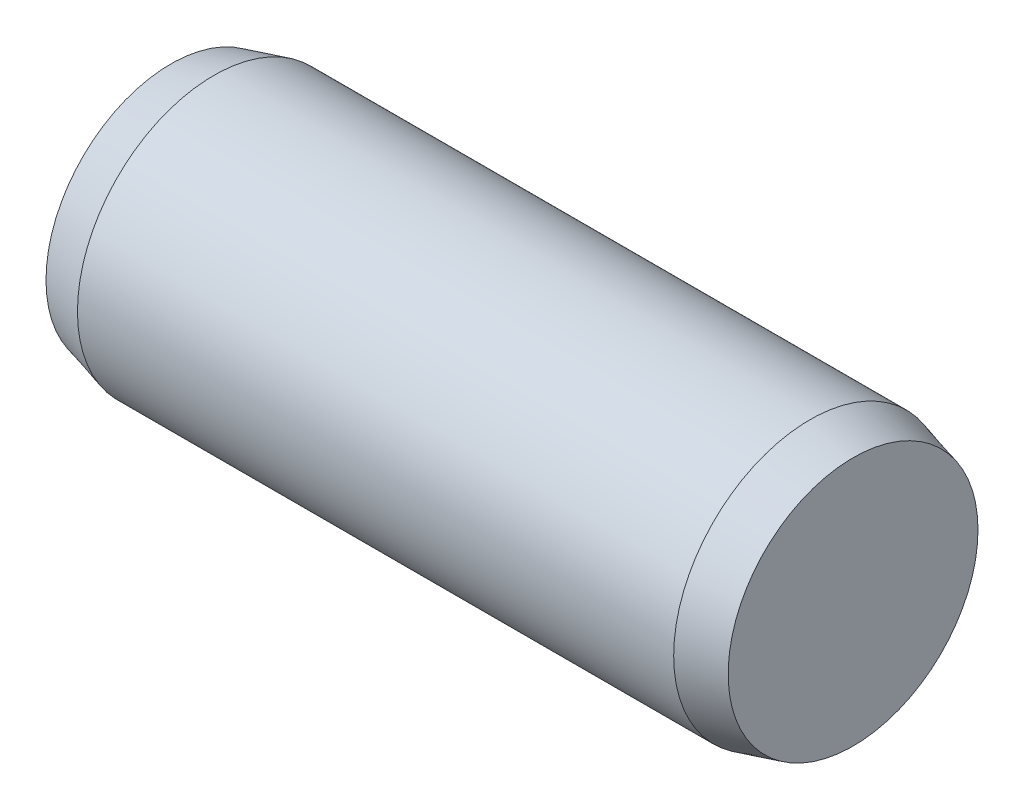
ISO-10303-21;
HEADER;
FILE_DESCRIPTION(('STEP AP214'),'2;1');
FILE_NAME('part.step','',(''),(''),'','','');
FILE_SCHEMA(('AUTOMOTIVE_DESIGN { 1 0 10303 214 1 1 1 1 }'));
ENDSEC;
DATA;
#1=APPLICATION_CONTEXT('core data for automotive mechanical design processes');
#2=APPLICATION_PROTOCOL_DEFINITION('international standard','automotive_design',2000,#1);
#3=PRODUCT_CONTEXT('',#1,'mechanical');
#4=PRODUCT('Part','Part','',(#3));
#5=PRODUCT_RELATED_PRODUCT_CATEGORY('part','',(#4));
#6=PRODUCT_DEFINITION_FORMATION('','',#4);
#7=PRODUCT_DEFINITION_CONTEXT('part definition',#1,'design');
#8=PRODUCT_DEFINITION('design','',#6,#7);
#9=PRODUCT_DEFINITION_SHAPE('','',#8);
#10=(LENGTH_UNIT() NAMED_UNIT(*) SI_UNIT(.MILLI.,.METRE.));
#11=(NAMED_UNIT(*) PLANE_ANGLE_UNIT() SI_UNIT($,.RADIAN.));
#12=(NAMED_UNIT(*) SI_UNIT($,.STERADIAN.) SOLID_ANGLE_UNIT());
#13=UNCERTAINTY_MEASURE_WITH_UNIT(LENGTH_MEASURE(1.E-05),#10,'distance_accuracy_value','');
#14=(GEOMETRIC_REPRESENTATION_CONTEXT(3) GLOBAL_UNCERTAINTY_ASSIGNED_CONTEXT((#13)) GLOBAL_UNIT_ASSIGNED_CONTEXT((#10,
#11,#12)) REPRESENTATION_CONTEXT('',''));
#15=CARTESIAN_POINT('',(0.,0.,0.));
#16=DIRECTION('',(0.,0.,1.));
#17=DIRECTION('',(1.,0.,0.));
#18=AXIS2_PLACEMENT_3D('',#15,#16,#17);
#19=CARTESIAN_POINT('',(-4.37,0.,0.));
#20=DIRECTION('',(1.,0.,0.));
#21=DIRECTION('',(0.,0.,-1.));
#22=AXIS2_PLACEMENT_3D('',#19,#20,#21);
#23=CYLINDRICAL_SURFACE('',#22,2.);
#24=CARTESIAN_POINT('',(-4.37,0.,0.));
#25=DIRECTION('',(-1.,0.,0.));
#26=DIRECTION('',(0.,0.,1.));
#27=AXIS2_PLACEMENT_3D('',#24,#25,#26);
#28=CIRCLE('',#27,2.);
#29=CARTESIAN_POINT('',(-4.37,0.,2.));
#30=VERTEX_POINT('',#29);
#31=EDGE_CURVE('E54',#30,#30,#28,.T.);
#32=ORIENTED_EDGE('',*,*,#31,.F.);
#33=EDGE_LOOP('',(#32));
#34=FACE_BOUND('',#33,.T.);
#35=CARTESIAN_POINT('',(4.37,0.,0.));
#36=DIRECTION('',(1.,0.,0.));
#37=DIRECTION('',(0.,0.,-1.));
#38=AXIS2_PLACEMENT_3D('',#35,#36,#37);
#39=CIRCLE('',#38,2.);
#40=CARTESIAN_POINT('',(4.37,0.,-2.));
#41=VERTEX_POINT('',#40);
#42=EDGE_CURVE('E10',#41,#41,#39,.T.);
#43=ORIENTED_EDGE('',*,*,#42,.F.);
#44=EDGE_LOOP('',(#43));
#45=FACE_BOUND('',#44,.T.);
#46=ADVANCED_FACE('F37',(#34,#45),#23,.T.);
#47=CARTESIAN_POINT('',(4.37,0.,0.));
#48=DIRECTION('',(-1.,0.,0.));
#49=DIRECTION('',(0.,0.,-1.));
#50=AXIS2_PLACEMENT_3D('',#47,#48,#49);
#51=CONICAL_SURFACE('',#50,2.,0.26179938779915);
#52=CARTESIAN_POINT('',(5.,0.,0.));
#53=DIRECTION('',(1.,0.,0.));
#54=DIRECTION('',(0.,0.,-1.));
#55=AXIS2_PLACEMENT_3D('',#52,#53,#54);
#56=CIRCLE('',#55,1.83119200876839);
#57=CARTESIAN_POINT('',(5.,0.,-1.83119200876839));
#58=VERTEX_POINT('',#57);
#59=EDGE_CURVE('E44',#58,#58,#56,.T.);
#60=ORIENTED_EDGE('',*,*,#59,.F.);
#61=EDGE_LOOP('',(#60));
#62=FACE_BOUND('',#61,.T.);
#63=ORIENTED_EDGE('',*,*,#42,.T.);
#64=EDGE_LOOP('',(#63));
#65=FACE_BOUND('',#64,.T.);
#66=ADVANCED_FACE('F65',(#62,#65),#51,.T.);
#67=CARTESIAN_POINT('',(5.,0.,0.));
#68=DIRECTION('',(1.,0.,0.));
#69=DIRECTION('',(0.,0.,-1.));
#70=AXIS2_PLACEMENT_3D('',#67,#68,#69);
#71=PLANE('',#70);
#72=ORIENTED_EDGE('',*,*,#59,.T.);
#73=EDGE_LOOP('',(#72));
#74=FACE_BOUND('',#73,.T.);
#75=ADVANCED_FACE('F69',(#74),#71,.T.);
#76=CARTESIAN_POINT('',(-4.37,0.,0.));
#77=DIRECTION('',(1.,0.,0.));
#78=DIRECTION('',(0.,0.,1.));
#79=AXIS2_PLACEMENT_3D('',#76,#77,#78);
#80=CONICAL_SURFACE('',#79,2.,0.26179938779915);
#81=CARTESIAN_POINT('',(-5.,0.,0.));
#82=DIRECTION('',(-1.,0.,0.));
#83=DIRECTION('',(0.,0.,1.));
#84=AXIS2_PLACEMENT_3D('',#81,#82,#83);
#85=CIRCLE('',#84,1.83119200876839);
#86=CARTESIAN_POINT('',(-5.,0.,1.83119200876839));
#87=VERTEX_POINT('',#86);
#88=EDGE_CURVE('E49',#87,#87,#85,.T.);
#89=ORIENTED_EDGE('',*,*,#88,.F.);
#90=EDGE_LOOP('',(#89));
#91=FACE_BOUND('',#90,.T.);
#92=ORIENTED_EDGE('',*,*,#31,.T.);
#93=EDGE_LOOP('',(#92));
#94=FACE_BOUND('',#93,.T.);
#95=ADVANCED_FACE('F61',(#91,#94),#80,.T.);
#96=CARTESIAN_POINT('',(-5.,0.,0.));
#97=DIRECTION('',(-1.,0.,0.));
#98=DIRECTION('',(0.,0.,1.));
#99=AXIS2_PLACEMENT_3D('',#96,#97,#98);
#100=PLANE('',#99);
#101=ORIENTED_EDGE('',*,*,#88,.T.);
#102=EDGE_LOOP('',(#101));
#103=FACE_BOUND('',#102,.T.);
#104=ADVANCED_FACE('F78',(#103),#100,.T.);
#105=CLOSED_SHELL('',(#46,#66,#75,#95,#104));
#106=MANIFOLD_SOLID_BREP('B2',#105);
#107=ADVANCED_BREP_SHAPE_REPRESENTATION('',(#18,#106),#14);
#108=SHAPE_DEFINITION_REPRESENTATION(#9,#107);
ENDSEC;
END-ISO-10303-21;
